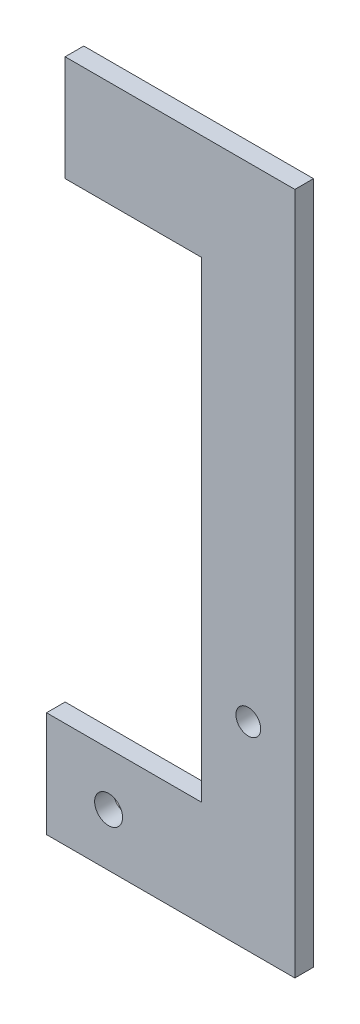
ISO-10303-21;
HEADER;
FILE_DESCRIPTION(('STEP AP214'),'2;1');
FILE_NAME('part.step','',(''),(''),'','','');
FILE_SCHEMA(('AUTOMOTIVE_DESIGN { 1 0 10303 214 1 1 1 1 }'));
ENDSEC;
DATA;
#1=APPLICATION_CONTEXT('core data for automotive mechanical design processes');
#2=APPLICATION_PROTOCOL_DEFINITION('international standard','automotive_design',2000,#1);
#3=PRODUCT_CONTEXT('',#1,'mechanical');
#4=PRODUCT('Part','Part','',(#3));
#5=PRODUCT_RELATED_PRODUCT_CATEGORY('part','',(#4));
#6=PRODUCT_DEFINITION_FORMATION('','',#4);
#7=PRODUCT_DEFINITION_CONTEXT('part definition',#1,'design');
#8=PRODUCT_DEFINITION('design','',#6,#7);
#9=PRODUCT_DEFINITION_SHAPE('','',#8);
#10=(LENGTH_UNIT() NAMED_UNIT(*) SI_UNIT(.MILLI.,.METRE.));
#11=(NAMED_UNIT(*) PLANE_ANGLE_UNIT() SI_UNIT($,.RADIAN.));
#12=(NAMED_UNIT(*) SI_UNIT($,.STERADIAN.) SOLID_ANGLE_UNIT());
#13=UNCERTAINTY_MEASURE_WITH_UNIT(LENGTH_MEASURE(1.E-05),#10,'distance_accuracy_value','');
#14=(GEOMETRIC_REPRESENTATION_CONTEXT(3) GLOBAL_UNCERTAINTY_ASSIGNED_CONTEXT((#13)) GLOBAL_UNIT_ASSIGNED_CONTEXT((#10,
#11,#12)) REPRESENTATION_CONTEXT('',''));
#15=CARTESIAN_POINT('',(0.,0.,0.));
#16=DIRECTION('',(0.,0.,1.));
#17=DIRECTION('',(1.,0.,0.));
#18=AXIS2_PLACEMENT_3D('',#15,#16,#17);
#19=CARTESIAN_POINT('',(0.,0.,3.));
#20=DIRECTION('',(0.,0.,1.));
#21=DIRECTION('',(1.,0.,0.));
#22=AXIS2_PLACEMENT_3D('',#19,#20,#21);
#23=PLANE('',#22);
#24=CARTESIAN_POINT('',(10.,8.5,3.));
#25=DIRECTION('',(0.,0.,1.));
#26=DIRECTION('',(1.,0.,0.));
#27=AXIS2_PLACEMENT_3D('',#24,#25,#26);
#28=CIRCLE('',#27,2.25);
#29=CARTESIAN_POINT('',(12.25,8.5,3.));
#30=VERTEX_POINT('',#29);
#31=EDGE_CURVE('E210',#30,#30,#28,.T.);
#32=ORIENTED_EDGE('',*,*,#31,.F.);
#33=EDGE_LOOP('',(#32));
#34=FACE_BOUND('',#33,.T.);
#35=DIRECTION('',(-1.,0.,0.));
#36=VECTOR('',#35,1.);
#37=CARTESIAN_POINT('',(25.,17.,3.));
#38=LINE('',#37,#36);
#39=CARTESIAN_POINT('',(25.,17.,3.));
#40=VERTEX_POINT('',#39);
#41=CARTESIAN_POINT('',(0.,17.,3.));
#42=VERTEX_POINT('',#41);
#43=EDGE_CURVE('E229',#40,#42,#38,.T.);
#44=ORIENTED_EDGE('',*,*,#43,.T.);
#45=DIRECTION('',(0.,-1.,0.));
#46=VECTOR('',#45,1.);
#47=CARTESIAN_POINT('',(0.,17.,3.));
#48=LINE('',#47,#46);
#49=CARTESIAN_POINT('',(0.,0.,3.));
#50=VERTEX_POINT('',#49);
#51=EDGE_CURVE('E164',#42,#50,#48,.T.);
#52=ORIENTED_EDGE('',*,*,#51,.T.);
#53=DIRECTION('',(1.,0.,0.));
#54=VECTOR('',#53,1.);
#55=CARTESIAN_POINT('',(0.,0.,3.));
#56=LINE('',#55,#54);
#57=CARTESIAN_POINT('',(40.,0.,3.));
#58=VERTEX_POINT('',#57);
#59=EDGE_CURVE('E250',#50,#58,#56,.T.);
#60=ORIENTED_EDGE('',*,*,#59,.T.);
#61=DIRECTION('',(0.,1.,0.));
#62=VECTOR('',#61,1.);
#63=CARTESIAN_POINT('',(40.,0.,3.));
#64=LINE('',#63,#62);
#65=CARTESIAN_POINT('',(40.,110.,3.));
#66=VERTEX_POINT('',#65);
#67=EDGE_CURVE('E263',#58,#66,#64,.T.);
#68=ORIENTED_EDGE('',*,*,#67,.T.);
#69=DIRECTION('',(-1.,0.,0.));
#70=VECTOR('',#69,1.);
#71=CARTESIAN_POINT('',(40.,110.,3.));
#72=LINE('',#71,#70);
#73=CARTESIAN_POINT('',(3.,110.,3.));
#74=VERTEX_POINT('',#73);
#75=EDGE_CURVE('E183',#66,#74,#72,.T.);
#76=ORIENTED_EDGE('',*,*,#75,.T.);
#77=DIRECTION('',(0.,-1.,0.));
#78=VECTOR('',#77,1.);
#79=CARTESIAN_POINT('',(3.,110.,3.));
#80=LINE('',#79,#78);
#81=CARTESIAN_POINT('',(3.,93.,3.));
#82=VERTEX_POINT('',#81);
#83=EDGE_CURVE('E177',#74,#82,#80,.T.);
#84=ORIENTED_EDGE('',*,*,#83,.T.);
#85=DIRECTION('',(1.,0.,0.));
#86=VECTOR('',#85,1.);
#87=CARTESIAN_POINT('',(3.,93.,3.));
#88=LINE('',#87,#86);
#89=CARTESIAN_POINT('',(25.,93.,3.));
#90=VERTEX_POINT('',#89);
#91=EDGE_CURVE('E181',#82,#90,#88,.T.);
#92=ORIENTED_EDGE('',*,*,#91,.T.);
#93=DIRECTION('',(0.,-1.,0.));
#94=VECTOR('',#93,1.);
#95=CARTESIAN_POINT('',(25.,93.,3.));
#96=LINE('',#95,#94);
#97=EDGE_CURVE('E121',#90,#40,#96,.T.);
#98=ORIENTED_EDGE('',*,*,#97,.T.);
#99=EDGE_LOOP('',(#44,#52,#60,#68,#76,#84,#92,#98));
#100=FACE_BOUND('',#99,.T.);
#101=CARTESIAN_POINT('',(32.5,32.,3.));
#102=DIRECTION('',(0.,0.,1.));
#103=DIRECTION('',(1.,0.,0.));
#104=AXIS2_PLACEMENT_3D('',#101,#102,#103);
#105=CIRCLE('',#104,2.);
#106=CARTESIAN_POINT('',(34.5,32.,3.));
#107=VERTEX_POINT('',#106);
#108=EDGE_CURVE('E277',#107,#107,#105,.T.);
#109=ORIENTED_EDGE('',*,*,#108,.F.);
#110=EDGE_LOOP('',(#109));
#111=FACE_BOUND('',#110,.T.);
#112=ADVANCED_FACE('F103',(#34,#100,#111),#23,.T.);
#113=CARTESIAN_POINT('',(0.,0.,0.));
#114=DIRECTION('',(0.,0.,1.));
#115=DIRECTION('',(1.,0.,0.));
#116=AXIS2_PLACEMENT_3D('',#113,#114,#115);
#117=PLANE('',#116);
#118=DIRECTION('',(-1.,0.,0.));
#119=VECTOR('',#118,1.);
#120=CARTESIAN_POINT('',(25.,17.,0.));
#121=LINE('',#120,#119);
#122=CARTESIAN_POINT('',(25.,17.,0.));
#123=VERTEX_POINT('',#122);
#124=CARTESIAN_POINT('',(0.,17.,0.));
#125=VERTEX_POINT('',#124);
#126=EDGE_CURVE('E205',#123,#125,#121,.T.);
#127=ORIENTED_EDGE('',*,*,#126,.F.);
#128=DIRECTION('',(0.,-1.,0.));
#129=VECTOR('',#128,1.);
#130=CARTESIAN_POINT('',(25.,93.,0.));
#131=LINE('',#130,#129);
#132=CARTESIAN_POINT('',(25.,93.,0.));
#133=VERTEX_POINT('',#132);
#134=EDGE_CURVE('E156',#133,#123,#131,.T.);
#135=ORIENTED_EDGE('',*,*,#134,.F.);
#136=DIRECTION('',(1.,0.,0.));
#137=VECTOR('',#136,1.);
#138=CARTESIAN_POINT('',(3.,93.,0.));
#139=LINE('',#138,#137);
#140=CARTESIAN_POINT('',(3.,93.,0.));
#141=VERTEX_POINT('',#140);
#142=EDGE_CURVE('E150',#141,#133,#139,.T.);
#143=ORIENTED_EDGE('',*,*,#142,.F.);
#144=DIRECTION('',(0.,-1.,0.));
#145=VECTOR('',#144,1.);
#146=CARTESIAN_POINT('',(3.,110.,0.));
#147=LINE('',#146,#145);
#148=CARTESIAN_POINT('',(3.,110.,0.));
#149=VERTEX_POINT('',#148);
#150=EDGE_CURVE('E192',#149,#141,#147,.T.);
#151=ORIENTED_EDGE('',*,*,#150,.F.);
#152=DIRECTION('',(-1.,0.,0.));
#153=VECTOR('',#152,1.);
#154=CARTESIAN_POINT('',(23.,110.,0.));
#155=LINE('',#154,#153);
#156=CARTESIAN_POINT('',(40.,110.,0.));
#157=VERTEX_POINT('',#156);
#158=EDGE_CURVE('E220',#157,#149,#155,.T.);
#159=ORIENTED_EDGE('',*,*,#158,.F.);
#160=DIRECTION('',(0.,1.,0.));
#161=VECTOR('',#160,1.);
#162=CARTESIAN_POINT('',(40.,0.,0.));
#163=LINE('',#162,#161);
#164=CARTESIAN_POINT('',(40.,0.,0.));
#165=VERTEX_POINT('',#164);
#166=EDGE_CURVE('E216',#165,#157,#163,.T.);
#167=ORIENTED_EDGE('',*,*,#166,.F.);
#168=DIRECTION('',(1.,0.,0.));
#169=VECTOR('',#168,1.);
#170=CARTESIAN_POINT('',(0.,0.,0.));
#171=LINE('',#170,#169);
#172=CARTESIAN_POINT('',(0.,0.,0.));
#173=VERTEX_POINT('',#172);
#174=EDGE_CURVE('E213',#173,#165,#171,.T.);
#175=ORIENTED_EDGE('',*,*,#174,.F.);
#176=DIRECTION('',(0.,-1.,0.));
#177=VECTOR('',#176,1.);
#178=CARTESIAN_POINT('',(0.,17.,0.));
#179=LINE('',#178,#177);
#180=EDGE_CURVE('E209',#125,#173,#179,.T.);
#181=ORIENTED_EDGE('',*,*,#180,.F.);
#182=EDGE_LOOP('',(#127,#135,#143,#151,#159,#167,#175,#181));
#183=FACE_BOUND('',#182,.T.);
#184=CARTESIAN_POINT('',(10.,8.5,0.));
#185=DIRECTION('',(0.,0.,1.));
#186=DIRECTION('',(1.,0.,0.));
#187=AXIS2_PLACEMENT_3D('',#184,#185,#186);
#188=CIRCLE('',#187,2.25);
#189=CARTESIAN_POINT('',(12.25,8.5,0.));
#190=VERTEX_POINT('',#189);
#191=EDGE_CURVE('E273',#190,#190,#188,.T.);
#192=ORIENTED_EDGE('',*,*,#191,.T.);
#193=EDGE_LOOP('',(#192));
#194=FACE_BOUND('',#193,.T.);
#195=CARTESIAN_POINT('',(32.5,32.,0.));
#196=DIRECTION('',(0.,0.,1.));
#197=DIRECTION('',(1.,0.,0.));
#198=AXIS2_PLACEMENT_3D('',#195,#196,#197);
#199=CIRCLE('',#198,2.);
#200=CARTESIAN_POINT('',(34.5,32.,0.));
#201=VERTEX_POINT('',#200);
#202=EDGE_CURVE('E281',#201,#201,#199,.T.);
#203=ORIENTED_EDGE('',*,*,#202,.T.);
#204=EDGE_LOOP('',(#203));
#205=FACE_BOUND('',#204,.T.);
#206=ADVANCED_FACE('F254',(#183,#194,#205),#117,.F.);
#207=CARTESIAN_POINT('',(25.,17.,3.));
#208=DIRECTION('',(0.,-1.,0.));
#209=DIRECTION('',(1.,0.,0.));
#210=AXIS2_PLACEMENT_3D('',#207,#208,#209);
#211=PLANE('',#210);
#212=ORIENTED_EDGE('',*,*,#126,.T.);
#213=DIRECTION('',(0.,0.,-1.));
#214=VECTOR('',#213,1.);
#215=CARTESIAN_POINT('',(0.,17.,3.));
#216=LINE('',#215,#214);
#217=EDGE_CURVE('E12',#42,#125,#216,.T.);
#218=ORIENTED_EDGE('',*,*,#217,.F.);
#219=ORIENTED_EDGE('',*,*,#43,.F.);
#220=DIRECTION('',(0.,0.,-1.));
#221=VECTOR('',#220,1.);
#222=CARTESIAN_POINT('',(25.,17.,3.));
#223=LINE('',#222,#221);
#224=EDGE_CURVE('E201',#40,#123,#223,.T.);
#225=ORIENTED_EDGE('',*,*,#224,.T.);
#226=EDGE_LOOP('',(#212,#218,#219,#225));
#227=FACE_BOUND('',#226,.T.);
#228=ADVANCED_FACE('F105',(#227),#211,.F.);
#229=CARTESIAN_POINT('',(0.,17.,3.));
#230=DIRECTION('',(1.,0.,0.));
#231=DIRECTION('',(0.,1.,0.));
#232=AXIS2_PLACEMENT_3D('',#229,#230,#231);
#233=PLANE('',#232);
#234=ORIENTED_EDGE('',*,*,#180,.T.);
#235=DIRECTION('',(0.,0.,-1.));
#236=VECTOR('',#235,1.);
#237=CARTESIAN_POINT('',(0.,0.,3.));
#238=LINE('',#237,#236);
#239=EDGE_CURVE('E113',#50,#173,#238,.T.);
#240=ORIENTED_EDGE('',*,*,#239,.F.);
#241=ORIENTED_EDGE('',*,*,#51,.F.);
#242=ORIENTED_EDGE('',*,*,#217,.T.);
#243=EDGE_LOOP('',(#234,#240,#241,#242));
#244=FACE_BOUND('',#243,.T.);
#245=ADVANCED_FACE('F315',(#244),#233,.F.);
#246=CARTESIAN_POINT('',(0.,0.,3.));
#247=DIRECTION('',(0.,1.,0.));
#248=DIRECTION('',(0.,0.,1.));
#249=AXIS2_PLACEMENT_3D('',#246,#247,#248);
#250=PLANE('',#249);
#251=ORIENTED_EDGE('',*,*,#174,.T.);
#252=DIRECTION('',(0.,0.,-1.));
#253=VECTOR('',#252,1.);
#254=CARTESIAN_POINT('',(40.,0.,3.));
#255=LINE('',#254,#253);
#256=EDGE_CURVE('E240',#58,#165,#255,.T.);
#257=ORIENTED_EDGE('',*,*,#256,.F.);
#258=ORIENTED_EDGE('',*,*,#59,.F.);
#259=ORIENTED_EDGE('',*,*,#239,.T.);
#260=EDGE_LOOP('',(#251,#257,#258,#259));
#261=FACE_BOUND('',#260,.T.);
#262=ADVANCED_FACE('F248',(#261),#250,.F.);
#263=CARTESIAN_POINT('',(40.,0.,3.));
#264=DIRECTION('',(-1.,0.,0.));
#265=DIRECTION('',(0.,0.,1.));
#266=AXIS2_PLACEMENT_3D('',#263,#264,#265);
#267=PLANE('',#266);
#268=ORIENTED_EDGE('',*,*,#166,.T.);
#269=DIRECTION('',(0.,0.,-1.));
#270=VECTOR('',#269,1.);
#271=CARTESIAN_POINT('',(40.,110.,3.));
#272=LINE('',#271,#270);
#273=EDGE_CURVE('E236',#66,#157,#272,.T.);
#274=ORIENTED_EDGE('',*,*,#273,.F.);
#275=ORIENTED_EDGE('',*,*,#67,.F.);
#276=ORIENTED_EDGE('',*,*,#256,.T.);
#277=EDGE_LOOP('',(#268,#274,#275,#276));
#278=FACE_BOUND('',#277,.T.);
#279=ADVANCED_FACE('F258',(#278),#267,.F.);
#280=CARTESIAN_POINT('',(23.,110.,3.));
#281=DIRECTION('',(0.,-1.,0.));
#282=DIRECTION('',(0.,0.,-1.));
#283=AXIS2_PLACEMENT_3D('',#280,#281,#282);
#284=PLANE('',#283);
#285=ORIENTED_EDGE('',*,*,#158,.T.);
#286=DIRECTION('',(0.,0.,-1.));
#287=VECTOR('',#286,1.);
#288=CARTESIAN_POINT('',(3.,110.,3.));
#289=LINE('',#288,#287);
#290=EDGE_CURVE('E194',#74,#149,#289,.T.);
#291=ORIENTED_EDGE('',*,*,#290,.F.);
#292=ORIENTED_EDGE('',*,*,#75,.F.);
#293=ORIENTED_EDGE('',*,*,#273,.T.);
#294=EDGE_LOOP('',(#285,#291,#292,#293));
#295=FACE_BOUND('',#294,.T.);
#296=ADVANCED_FACE('F261',(#295),#284,.F.);
#297=CARTESIAN_POINT('',(3.,110.,3.));
#298=DIRECTION('',(1.,0.,0.));
#299=DIRECTION('',(0.,1.,0.));
#300=AXIS2_PLACEMENT_3D('',#297,#298,#299);
#301=PLANE('',#300);
#302=ORIENTED_EDGE('',*,*,#150,.T.);
#303=DIRECTION('',(0.,0.,-1.));
#304=VECTOR('',#303,1.);
#305=CARTESIAN_POINT('',(3.,93.,3.));
#306=LINE('',#305,#304);
#307=EDGE_CURVE('E189',#82,#141,#306,.T.);
#308=ORIENTED_EDGE('',*,*,#307,.F.);
#309=ORIENTED_EDGE('',*,*,#83,.F.);
#310=ORIENTED_EDGE('',*,*,#290,.T.);
#311=EDGE_LOOP('',(#302,#308,#309,#310));
#312=FACE_BOUND('',#311,.T.);
#313=ADVANCED_FACE('F190',(#312),#301,.F.);
#314=CARTESIAN_POINT('',(3.,93.,3.));
#315=DIRECTION('',(0.,1.,0.));
#316=DIRECTION('',(0.,0.,1.));
#317=AXIS2_PLACEMENT_3D('',#314,#315,#316);
#318=PLANE('',#317);
#319=ORIENTED_EDGE('',*,*,#142,.T.);
#320=DIRECTION('',(0.,0.,-1.));
#321=VECTOR('',#320,1.);
#322=CARTESIAN_POINT('',(25.,93.,3.));
#323=LINE('',#322,#321);
#324=EDGE_CURVE('E195',#90,#133,#323,.T.);
#325=ORIENTED_EDGE('',*,*,#324,.F.);
#326=ORIENTED_EDGE('',*,*,#91,.F.);
#327=ORIENTED_EDGE('',*,*,#307,.T.);
#328=EDGE_LOOP('',(#319,#325,#326,#327));
#329=FACE_BOUND('',#328,.T.);
#330=ADVANCED_FACE('F197',(#329),#318,.F.);
#331=CARTESIAN_POINT('',(25.,93.,3.));
#332=DIRECTION('',(1.,0.,0.));
#333=DIRECTION('',(0.,1.,0.));
#334=AXIS2_PLACEMENT_3D('',#331,#332,#333);
#335=PLANE('',#334);
#336=ORIENTED_EDGE('',*,*,#134,.T.);
#337=ORIENTED_EDGE('',*,*,#224,.F.);
#338=ORIENTED_EDGE('',*,*,#97,.F.);
#339=ORIENTED_EDGE('',*,*,#324,.T.);
#340=EDGE_LOOP('',(#336,#337,#338,#339));
#341=FACE_BOUND('',#340,.T.);
#342=ADVANCED_FACE('F303',(#341),#335,.F.);
#343=CARTESIAN_POINT('',(10.,8.5,3.));
#344=DIRECTION('',(0.,0.,-1.));
#345=DIRECTION('',(-1.,0.,0.));
#346=AXIS2_PLACEMENT_3D('',#343,#344,#345);
#347=CYLINDRICAL_SURFACE('',#346,2.25);
#348=ORIENTED_EDGE('',*,*,#31,.T.);
#349=EDGE_LOOP('',(#348));
#350=FACE_BOUND('',#349,.T.);
#351=ORIENTED_EDGE('',*,*,#191,.F.);
#352=EDGE_LOOP('',(#351));
#353=FACE_BOUND('',#352,.T.);
#354=ADVANCED_FACE('F300',(#350,#353),#347,.F.);
#355=CARTESIAN_POINT('',(32.5,32.,3.));
#356=DIRECTION('',(0.,0.,-1.));
#357=DIRECTION('',(-1.,0.,0.));
#358=AXIS2_PLACEMENT_3D('',#355,#356,#357);
#359=CYLINDRICAL_SURFACE('',#358,2.);
#360=ORIENTED_EDGE('',*,*,#108,.T.);
#361=EDGE_LOOP('',(#360));
#362=FACE_BOUND('',#361,.T.);
#363=ORIENTED_EDGE('',*,*,#202,.F.);
#364=EDGE_LOOP('',(#363));
#365=FACE_BOUND('',#364,.T.);
#366=ADVANCED_FACE('F289',(#362,#365),#359,.F.);
#367=CLOSED_SHELL('',(#112,#206,#228,#245,#262,#279,#296,#313,#330,#342,#354,#366));
#368=MANIFOLD_SOLID_BREP('B2',#367);
#369=ADVANCED_BREP_SHAPE_REPRESENTATION('',(#18,#368),#14);
#370=SHAPE_DEFINITION_REPRESENTATION(#9,#369);
ENDSEC;
END-ISO-10303-21;
